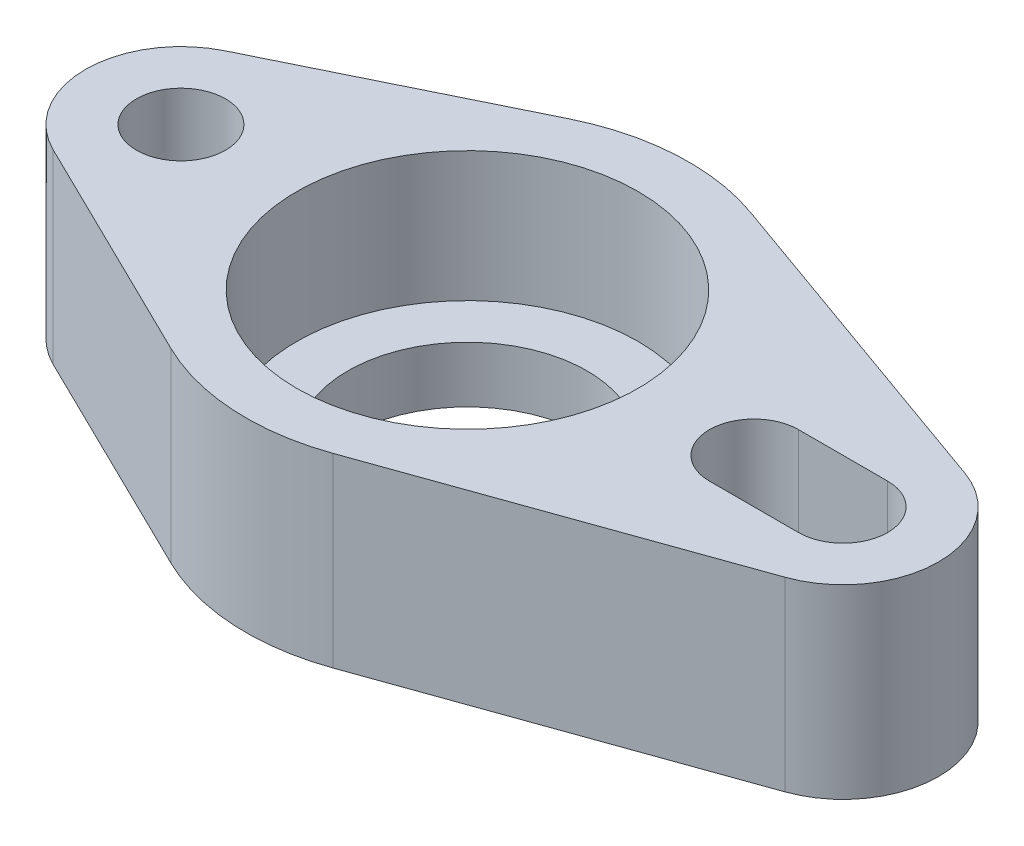
ISO-10303-21;
HEADER;
FILE_DESCRIPTION(('STEP AP214'),'2;1');
FILE_NAME('part.step','',(''),(''),'','','');
FILE_SCHEMA(('AUTOMOTIVE_DESIGN { 1 0 10303 214 1 1 1 1 }'));
ENDSEC;
DATA;
#1=APPLICATION_CONTEXT('core data for automotive mechanical design processes');
#2=APPLICATION_PROTOCOL_DEFINITION('international standard','automotive_design',2000,#1);
#3=PRODUCT_CONTEXT('',#1,'mechanical');
#4=PRODUCT('Part','Part','',(#3));
#5=PRODUCT_RELATED_PRODUCT_CATEGORY('part','',(#4));
#6=PRODUCT_DEFINITION_FORMATION('','',#4);
#7=PRODUCT_DEFINITION_CONTEXT('part definition',#1,'design');
#8=PRODUCT_DEFINITION('design','',#6,#7);
#9=PRODUCT_DEFINITION_SHAPE('','',#8);
#10=(LENGTH_UNIT() NAMED_UNIT(*) SI_UNIT(.MILLI.,.METRE.));
#11=(NAMED_UNIT(*) PLANE_ANGLE_UNIT() SI_UNIT($,.RADIAN.));
#12=(NAMED_UNIT(*) SI_UNIT($,.STERADIAN.) SOLID_ANGLE_UNIT());
#13=UNCERTAINTY_MEASURE_WITH_UNIT(LENGTH_MEASURE(1.E-05),#10,'distance_accuracy_value','');
#14=(GEOMETRIC_REPRESENTATION_CONTEXT(3) GLOBAL_UNCERTAINTY_ASSIGNED_CONTEXT((#13)) GLOBAL_UNIT_ASSIGNED_CONTEXT((#10,
#11,#12)) REPRESENTATION_CONTEXT('',''));
#15=CARTESIAN_POINT('',(0.,0.,0.));
#16=DIRECTION('',(0.,0.,1.));
#17=DIRECTION('',(1.,0.,0.));
#18=AXIS2_PLACEMENT_3D('',#15,#16,#17);
#19=CARTESIAN_POINT('',(2.91966101694915,7.3,8.19546091114511));
#20=DIRECTION('',(0.335593220338983,0.,0.942007001281047));
#21=DIRECTION('',(0.942007001281047,0.,-0.335593220338983));
#22=AXIS2_PLACEMENT_3D('',#19,#20,#21);
#23=PLANE('',#22);
#24=DIRECTION('',(-0.942007001281047,0.,0.335593220338983));
#25=VECTOR('',#24,1.);
#26=CARTESIAN_POINT('',(2.91966101694915,0.,8.19546091114511));
#27=LINE('',#26,#25);
#28=CARTESIAN_POINT('',(16.0084745762712,0.,3.53252625480393));
#29=VERTEX_POINT('',#28);
#30=CARTESIAN_POINT('',(2.91966101694915,0.,8.19546091114511));
#31=VERTEX_POINT('',#30);
#32=EDGE_CURVE('E236',#29,#31,#27,.T.);
#33=ORIENTED_EDGE('',*,*,#32,.F.);
#34=DIRECTION('',(0.,-1.,0.));
#35=VECTOR('',#34,1.);
#36=CARTESIAN_POINT('',(16.0084745762712,7.3,3.53252625480393));
#37=LINE('',#36,#35);
#38=CARTESIAN_POINT('',(16.0084745762712,7.3,3.53252625480393));
#39=VERTEX_POINT('',#38);
#40=EDGE_CURVE('E57',#39,#29,#37,.T.);
#41=ORIENTED_EDGE('',*,*,#40,.F.);
#42=DIRECTION('',(-0.942007001281047,0.,0.335593220338983));
#43=VECTOR('',#42,1.);
#44=CARTESIAN_POINT('',(2.91966101694915,7.3,8.19546091114511));
#45=LINE('',#44,#43);
#46=CARTESIAN_POINT('',(2.91966101694915,7.3,8.19546091114511));
#47=VERTEX_POINT('',#46);
#48=EDGE_CURVE('E277',#39,#47,#45,.T.);
#49=ORIENTED_EDGE('',*,*,#48,.T.);
#50=DIRECTION('',(0.,-1.,0.));
#51=VECTOR('',#50,1.);
#52=CARTESIAN_POINT('',(2.91966101694915,7.3,8.19546091114511));
#53=LINE('',#52,#51);
#54=EDGE_CURVE('E112',#47,#31,#53,.T.);
#55=ORIENTED_EDGE('',*,*,#54,.T.);
#56=EDGE_LOOP('',(#33,#41,#49,#55));
#57=FACE_BOUND('',#56,.T.);
#58=ADVANCED_FACE('F47',(#57),#23,.T.);
#59=CARTESIAN_POINT('',(14.75,7.3,0.));
#60=DIRECTION('',(0.,-1.,0.));
#61=DIRECTION('',(0.,0.,-1.));
#62=AXIS2_PLACEMENT_3D('',#59,#60,#61);
#63=CYLINDRICAL_SURFACE('',#62,3.75);
#64=CARTESIAN_POINT('',(14.75,0.,0.));
#65=DIRECTION('',(0.,1.,0.));
#66=DIRECTION('',(0.,0.,1.));
#67=AXIS2_PLACEMENT_3D('',#64,#65,#66);
#68=CIRCLE('',#67,3.75);
#69=CARTESIAN_POINT('',(16.0084745762712,0.,-3.53252625480393));
#70=VERTEX_POINT('',#69);
#71=EDGE_CURVE('E232',#29,#70,#68,.T.);
#72=ORIENTED_EDGE('',*,*,#71,.T.);
#73=DIRECTION('',(0.,-1.,0.));
#74=VECTOR('',#73,1.);
#75=CARTESIAN_POINT('',(16.0084745762712,7.3,-3.53252625480393));
#76=LINE('',#75,#74);
#77=CARTESIAN_POINT('',(16.0084745762712,7.3,-3.53252625480393));
#78=VERTEX_POINT('',#77);
#79=EDGE_CURVE('E187',#78,#70,#76,.T.);
#80=ORIENTED_EDGE('',*,*,#79,.F.);
#81=CARTESIAN_POINT('',(14.75,7.3,0.));
#82=DIRECTION('',(0.,1.,0.));
#83=DIRECTION('',(0.,0.,1.));
#84=AXIS2_PLACEMENT_3D('',#81,#82,#83);
#85=CIRCLE('',#84,3.75);
#86=EDGE_CURVE('E273',#39,#78,#85,.T.);
#87=ORIENTED_EDGE('',*,*,#86,.F.);
#88=ORIENTED_EDGE('',*,*,#40,.T.);
#89=EDGE_LOOP('',(#72,#80,#87,#88));
#90=FACE_BOUND('',#89,.T.);
#91=ADVANCED_FACE('F341',(#90),#63,.T.);
#92=CARTESIAN_POINT('',(2.91966101694915,7.3,-8.19546091114511));
#93=DIRECTION('',(-0.335593220338983,0.,0.942007001281047));
#94=DIRECTION('',(0.942007001281047,0.,0.335593220338983));
#95=AXIS2_PLACEMENT_3D('',#92,#93,#94);
#96=PLANE('',#95);
#97=DIRECTION('',(-0.942007001281047,0.,-0.335593220338983));
#98=VECTOR('',#97,1.);
#99=CARTESIAN_POINT('',(2.91966101694915,0.,-8.19546091114511));
#100=LINE('',#99,#98);
#101=CARTESIAN_POINT('',(2.91966101694916,0.,-8.19546091114511));
#102=VERTEX_POINT('',#101);
#103=EDGE_CURVE('E228',#70,#102,#100,.T.);
#104=ORIENTED_EDGE('',*,*,#103,.T.);
#105=DIRECTION('',(0.,-1.,0.));
#106=VECTOR('',#105,1.);
#107=CARTESIAN_POINT('',(2.91966101694916,7.3,-8.19546091114511));
#108=LINE('',#107,#106);
#109=CARTESIAN_POINT('',(2.91966101694916,7.3,-8.19546091114511));
#110=VERTEX_POINT('',#109);
#111=EDGE_CURVE('E183',#110,#102,#108,.T.);
#112=ORIENTED_EDGE('',*,*,#111,.F.);
#113=DIRECTION('',(-0.942007001281047,0.,-0.335593220338983));
#114=VECTOR('',#113,1.);
#115=CARTESIAN_POINT('',(2.91966101694915,7.3,-8.19546091114511));
#116=LINE('',#115,#114);
#117=EDGE_CURVE('E269',#78,#110,#116,.T.);
#118=ORIENTED_EDGE('',*,*,#117,.F.);
#119=ORIENTED_EDGE('',*,*,#79,.T.);
#120=EDGE_LOOP('',(#104,#112,#118,#119));
#121=FACE_BOUND('',#120,.T.);
#122=ADVANCED_FACE('F346',(#121),#96,.F.);
#123=CARTESIAN_POINT('',(0.,7.3,0.));
#124=DIRECTION('',(0.,-1.,0.));
#125=DIRECTION('',(0.,0.,-1.));
#126=AXIS2_PLACEMENT_3D('',#123,#124,#125);
#127=CYLINDRICAL_SURFACE('',#126,8.7);
#128=CARTESIAN_POINT('',(0.,0.,0.));
#129=DIRECTION('',(0.,1.,0.));
#130=DIRECTION('',(0.,0.,1.));
#131=AXIS2_PLACEMENT_3D('',#128,#129,#130);
#132=CIRCLE('',#131,8.7);
#133=CARTESIAN_POINT('',(-3.828,0.,-7.81258062358399));
#134=VERTEX_POINT('',#133);
#135=EDGE_CURVE('E224',#102,#134,#132,.T.);
#136=ORIENTED_EDGE('',*,*,#135,.T.);
#137=DIRECTION('',(0.,-1.,0.));
#138=VECTOR('',#137,1.);
#139=CARTESIAN_POINT('',(-3.828,7.3,-7.81258062358399));
#140=LINE('',#139,#138);
#141=CARTESIAN_POINT('',(-3.828,7.3,-7.81258062358399));
#142=VERTEX_POINT('',#141);
#143=EDGE_CURVE('E176',#142,#134,#140,.T.);
#144=ORIENTED_EDGE('',*,*,#143,.F.);
#145=CARTESIAN_POINT('',(0.,7.3,0.));
#146=DIRECTION('',(0.,1.,0.));
#147=DIRECTION('',(0.,0.,1.));
#148=AXIS2_PLACEMENT_3D('',#145,#146,#147);
#149=CIRCLE('',#148,8.7);
#150=EDGE_CURVE('E266',#110,#142,#149,.T.);
#151=ORIENTED_EDGE('',*,*,#150,.F.);
#152=ORIENTED_EDGE('',*,*,#111,.T.);
#153=EDGE_LOOP('',(#136,#144,#151,#152));
#154=FACE_BOUND('',#153,.T.);
#155=ADVANCED_FACE('F374',(#154),#127,.T.);
#156=CARTESIAN_POINT('',(-3.828,7.3,-7.81258062358399));
#157=DIRECTION('',(-0.44,0.,-0.897997772825746));
#158=DIRECTION('',(-0.897997772825746,0.,0.44));
#159=AXIS2_PLACEMENT_3D('',#156,#157,#158);
#160=PLANE('',#159);
#161=DIRECTION('',(0.897997772825746,0.,-0.44));
#162=VECTOR('',#161,1.);
#163=CARTESIAN_POINT('',(-3.828,0.,-7.81258062358399));
#164=LINE('',#163,#162);
#165=CARTESIAN_POINT('',(-12.9,0.,-3.36749164809655));
#166=VERTEX_POINT('',#165);
#167=EDGE_CURVE('E220',#166,#134,#164,.T.);
#168=ORIENTED_EDGE('',*,*,#167,.F.);
#169=DIRECTION('',(0.,-1.,0.));
#170=VECTOR('',#169,1.);
#171=CARTESIAN_POINT('',(-12.9,7.3,-3.36749164809655));
#172=LINE('',#171,#170);
#173=CARTESIAN_POINT('',(-12.9,7.3,-3.36749164809655));
#174=VERTEX_POINT('',#173);
#175=EDGE_CURVE('E172',#174,#166,#172,.T.);
#176=ORIENTED_EDGE('',*,*,#175,.F.);
#177=DIRECTION('',(0.897997772825746,0.,-0.44));
#178=VECTOR('',#177,1.);
#179=CARTESIAN_POINT('',(-3.828,7.3,-7.81258062358399));
#180=LINE('',#179,#178);
#181=EDGE_CURVE('E164',#174,#142,#180,.T.);
#182=ORIENTED_EDGE('',*,*,#181,.T.);
#183=ORIENTED_EDGE('',*,*,#143,.T.);
#184=EDGE_LOOP('',(#168,#176,#182,#183));
#185=FACE_BOUND('',#184,.T.);
#186=ADVANCED_FACE('F377',(#185),#160,.T.);
#187=CARTESIAN_POINT('',(-11.25,7.3,0.));
#188=DIRECTION('',(0.,-1.,0.));
#189=DIRECTION('',(0.,0.,-1.));
#190=AXIS2_PLACEMENT_3D('',#187,#188,#189);
#191=CYLINDRICAL_SURFACE('',#190,3.75);
#192=CARTESIAN_POINT('',(-11.25,0.,0.));
#193=DIRECTION('',(0.,1.,0.));
#194=DIRECTION('',(0.,0.,1.));
#195=AXIS2_PLACEMENT_3D('',#192,#193,#194);
#196=CIRCLE('',#195,3.75);
#197=CARTESIAN_POINT('',(-12.9,0.,3.36749164809655));
#198=VERTEX_POINT('',#197);
#199=EDGE_CURVE('E170',#166,#198,#196,.T.);
#200=ORIENTED_EDGE('',*,*,#199,.T.);
#201=DIRECTION('',(0.,-1.,0.));
#202=VECTOR('',#201,1.);
#203=CARTESIAN_POINT('',(-12.9,7.3,3.36749164809655));
#204=LINE('',#203,#202);
#205=CARTESIAN_POINT('',(-12.9,7.3,3.36749164809655));
#206=VERTEX_POINT('',#205);
#207=EDGE_CURVE('E153',#206,#198,#204,.T.);
#208=ORIENTED_EDGE('',*,*,#207,.F.);
#209=CARTESIAN_POINT('',(-11.25,7.3,0.));
#210=DIRECTION('',(0.,1.,0.));
#211=DIRECTION('',(0.,0.,1.));
#212=AXIS2_PLACEMENT_3D('',#209,#210,#211);
#213=CIRCLE('',#212,3.75);
#214=EDGE_CURVE('E157',#174,#206,#213,.T.);
#215=ORIENTED_EDGE('',*,*,#214,.F.);
#216=ORIENTED_EDGE('',*,*,#175,.T.);
#217=EDGE_LOOP('',(#200,#208,#215,#216));
#218=FACE_BOUND('',#217,.T.);
#219=ADVANCED_FACE('F168',(#218),#191,.T.);
#220=CARTESIAN_POINT('',(-3.828,7.3,7.81258062358399));
#221=DIRECTION('',(0.44,0.,-0.897997772825746));
#222=DIRECTION('',(-0.897997772825746,0.,-0.44));
#223=AXIS2_PLACEMENT_3D('',#220,#221,#222);
#224=PLANE('',#223);
#225=DIRECTION('',(0.897997772825746,0.,0.44));
#226=VECTOR('',#225,1.);
#227=CARTESIAN_POINT('',(-3.828,0.,7.81258062358399));
#228=LINE('',#227,#226);
#229=CARTESIAN_POINT('',(-3.828,0.,7.81258062358399));
#230=VERTEX_POINT('',#229);
#231=EDGE_CURVE('E215',#198,#230,#228,.T.);
#232=ORIENTED_EDGE('',*,*,#231,.T.);
#233=DIRECTION('',(0.,-1.,0.));
#234=VECTOR('',#233,1.);
#235=CARTESIAN_POINT('',(-3.828,7.3,7.81258062358399));
#236=LINE('',#235,#234);
#237=CARTESIAN_POINT('',(-3.828,7.3,7.81258062358399));
#238=VERTEX_POINT('',#237);
#239=EDGE_CURVE('E155',#238,#230,#236,.T.);
#240=ORIENTED_EDGE('',*,*,#239,.F.);
#241=DIRECTION('',(0.897997772825746,0.,0.44));
#242=VECTOR('',#241,1.);
#243=CARTESIAN_POINT('',(-3.828,7.3,7.81258062358399));
#244=LINE('',#243,#242);
#245=EDGE_CURVE('E148',#206,#238,#244,.T.);
#246=ORIENTED_EDGE('',*,*,#245,.F.);
#247=ORIENTED_EDGE('',*,*,#207,.T.);
#248=EDGE_LOOP('',(#232,#240,#246,#247));
#249=FACE_BOUND('',#248,.T.);
#250=ADVANCED_FACE('F151',(#249),#224,.F.);
#251=CARTESIAN_POINT('',(11.25,7.3,0.));
#252=DIRECTION('',(0.,-1.,0.));
#253=DIRECTION('',(0.,0.,-1.));
#254=AXIS2_PLACEMENT_3D('',#251,#252,#253);
#255=CYLINDRICAL_SURFACE('',#254,1.75);
#256=CARTESIAN_POINT('',(11.25,0.,0.));
#257=DIRECTION('',(0.,1.,0.));
#258=DIRECTION('',(0.,0.,1.));
#259=AXIS2_PLACEMENT_3D('',#256,#257,#258);
#260=CIRCLE('',#259,1.75);
#261=CARTESIAN_POINT('',(11.25,0.,-1.75));
#262=VERTEX_POINT('',#261);
#263=CARTESIAN_POINT('',(11.25,0.,1.75));
#264=VERTEX_POINT('',#263);
#265=EDGE_CURVE('E250',#262,#264,#260,.T.);
#266=ORIENTED_EDGE('',*,*,#265,.F.);
#267=DIRECTION('',(0.,-1.,0.));
#268=VECTOR('',#267,1.);
#269=CARTESIAN_POINT('',(11.25,7.3,-1.75));
#270=LINE('',#269,#268);
#271=CARTESIAN_POINT('',(11.25,7.3,-1.75));
#272=VERTEX_POINT('',#271);
#273=EDGE_CURVE('E119',#272,#262,#270,.T.);
#274=ORIENTED_EDGE('',*,*,#273,.F.);
#275=CARTESIAN_POINT('',(11.25,7.3,0.));
#276=DIRECTION('',(0.,1.,0.));
#277=DIRECTION('',(0.,0.,1.));
#278=AXIS2_PLACEMENT_3D('',#275,#276,#277);
#279=CIRCLE('',#278,1.75);
#280=CARTESIAN_POINT('',(11.25,7.3,1.75));
#281=VERTEX_POINT('',#280);
#282=EDGE_CURVE('E212',#272,#281,#279,.T.);
#283=ORIENTED_EDGE('',*,*,#282,.T.);
#284=DIRECTION('',(0.,-1.,0.));
#285=VECTOR('',#284,1.);
#286=CARTESIAN_POINT('',(11.25,7.3,1.75));
#287=LINE('',#286,#285);
#288=EDGE_CURVE('E193',#281,#264,#287,.T.);
#289=ORIENTED_EDGE('',*,*,#288,.T.);
#290=EDGE_LOOP('',(#266,#274,#283,#289));
#291=FACE_BOUND('',#290,.T.);
#292=ADVANCED_FACE('F49',(#291),#255,.F.);
#293=CARTESIAN_POINT('',(0.,7.3,-1.75));
#294=DIRECTION('',(0.,0.,-1.));
#295=DIRECTION('',(-1.,0.,0.));
#296=AXIS2_PLACEMENT_3D('',#293,#294,#295);
#297=PLANE('',#296);
#298=DIRECTION('',(1.,0.,0.));
#299=VECTOR('',#298,1.);
#300=CARTESIAN_POINT('',(0.,0.,-1.75));
#301=LINE('',#300,#299);
#302=CARTESIAN_POINT('',(14.75,0.,-1.75));
#303=VERTEX_POINT('',#302);
#304=EDGE_CURVE('E247',#262,#303,#301,.T.);
#305=ORIENTED_EDGE('',*,*,#304,.T.);
#306=DIRECTION('',(0.,-1.,0.));
#307=VECTOR('',#306,1.);
#308=CARTESIAN_POINT('',(14.75,7.3,-1.75));
#309=LINE('',#308,#307);
#310=CARTESIAN_POINT('',(14.75,7.3,-1.75));
#311=VERTEX_POINT('',#310);
#312=EDGE_CURVE('E200',#311,#303,#309,.T.);
#313=ORIENTED_EDGE('',*,*,#312,.F.);
#314=DIRECTION('',(1.,0.,0.));
#315=VECTOR('',#314,1.);
#316=CARTESIAN_POINT('',(0.,7.3,-1.75));
#317=LINE('',#316,#315);
#318=EDGE_CURVE('E288',#272,#311,#317,.T.);
#319=ORIENTED_EDGE('',*,*,#318,.F.);
#320=ORIENTED_EDGE('',*,*,#273,.T.);
#321=EDGE_LOOP('',(#305,#313,#319,#320));
#322=FACE_BOUND('',#321,.T.);
#323=ADVANCED_FACE('F355',(#322),#297,.F.);
#324=CARTESIAN_POINT('',(14.75,7.3,0.));
#325=DIRECTION('',(0.,-1.,0.));
#326=DIRECTION('',(0.,0.,-1.));
#327=AXIS2_PLACEMENT_3D('',#324,#325,#326);
#328=CYLINDRICAL_SURFACE('',#327,1.75);
#329=CARTESIAN_POINT('',(14.75,0.,0.));
#330=DIRECTION('',(0.,1.,0.));
#331=DIRECTION('',(0.,0.,1.));
#332=AXIS2_PLACEMENT_3D('',#329,#330,#331);
#333=CIRCLE('',#332,1.75);
#334=CARTESIAN_POINT('',(14.75,0.,1.75));
#335=VERTEX_POINT('',#334);
#336=EDGE_CURVE('E243',#335,#303,#333,.T.);
#337=ORIENTED_EDGE('',*,*,#336,.F.);
#338=DIRECTION('',(0.,-1.,0.));
#339=VECTOR('',#338,1.);
#340=CARTESIAN_POINT('',(14.75,7.3,1.75));
#341=LINE('',#340,#339);
#342=CARTESIAN_POINT('',(14.75,7.3,1.75));
#343=VERTEX_POINT('',#342);
#344=EDGE_CURVE('E196',#343,#335,#341,.T.);
#345=ORIENTED_EDGE('',*,*,#344,.F.);
#346=CARTESIAN_POINT('',(14.75,7.3,0.));
#347=DIRECTION('',(0.,1.,0.));
#348=DIRECTION('',(0.,0.,1.));
#349=AXIS2_PLACEMENT_3D('',#346,#347,#348);
#350=CIRCLE('',#349,1.75);
#351=EDGE_CURVE('E284',#343,#311,#350,.T.);
#352=ORIENTED_EDGE('',*,*,#351,.T.);
#353=ORIENTED_EDGE('',*,*,#312,.T.);
#354=EDGE_LOOP('',(#337,#345,#352,#353));
#355=FACE_BOUND('',#354,.T.);
#356=ADVANCED_FACE('F314',(#355),#328,.F.);
#357=CARTESIAN_POINT('',(0.,7.3,0.));
#358=DIRECTION('',(0.,-1.,0.));
#359=DIRECTION('',(0.,0.,-1.));
#360=AXIS2_PLACEMENT_3D('',#357,#358,#359);
#361=CYLINDRICAL_SURFACE('',#360,6.7);
#362=CARTESIAN_POINT('',(0.,2.2,0.));
#363=DIRECTION('',(0.,1.,0.));
#364=DIRECTION('',(0.,0.,1.));
#365=AXIS2_PLACEMENT_3D('',#362,#363,#364);
#366=CIRCLE('',#365,6.7);
#367=CARTESIAN_POINT('',(0.,2.2,6.7));
#368=VERTEX_POINT('',#367);
#369=EDGE_CURVE('E11',#368,#368,#366,.T.);
#370=ORIENTED_EDGE('',*,*,#369,.F.);
#371=EDGE_LOOP('',(#370));
#372=FACE_BOUND('',#371,.T.);
#373=CARTESIAN_POINT('',(0.,7.3,0.));
#374=DIRECTION('',(0.,1.,0.));
#375=DIRECTION('',(0.,0.,1.));
#376=AXIS2_PLACEMENT_3D('',#373,#374,#375);
#377=CIRCLE('',#376,6.7);
#378=CARTESIAN_POINT('',(0.,7.3,6.7));
#379=VERTEX_POINT('',#378);
#380=EDGE_CURVE('E258',#379,#379,#377,.T.);
#381=ORIENTED_EDGE('',*,*,#380,.T.);
#382=EDGE_LOOP('',(#381));
#383=FACE_BOUND('',#382,.T.);
#384=ADVANCED_FACE('F310',(#372,#383),#361,.F.);
#385=CARTESIAN_POINT('',(0.,7.3,0.));
#386=DIRECTION('',(0.,-1.,0.));
#387=DIRECTION('',(0.,0.,-1.));
#388=AXIS2_PLACEMENT_3D('',#385,#386,#387);
#389=CYLINDRICAL_SURFACE('',#388,8.7);
#390=CARTESIAN_POINT('',(0.,0.,0.));
#391=DIRECTION('',(0.,1.,0.));
#392=DIRECTION('',(0.,0.,1.));
#393=AXIS2_PLACEMENT_3D('',#390,#391,#392);
#394=CIRCLE('',#393,8.7);
#395=EDGE_CURVE('E105',#230,#31,#394,.T.);
#396=ORIENTED_EDGE('',*,*,#395,.T.);
#397=ORIENTED_EDGE('',*,*,#54,.F.);
#398=CARTESIAN_POINT('',(0.,7.3,0.));
#399=DIRECTION('',(0.,1.,0.));
#400=DIRECTION('',(0.,0.,1.));
#401=AXIS2_PLACEMENT_3D('',#398,#399,#400);
#402=CIRCLE('',#401,8.7);
#403=EDGE_CURVE('E65',#238,#47,#402,.T.);
#404=ORIENTED_EDGE('',*,*,#403,.F.);
#405=ORIENTED_EDGE('',*,*,#239,.T.);
#406=EDGE_LOOP('',(#396,#397,#404,#405));
#407=FACE_BOUND('',#406,.T.);
#408=ADVANCED_FACE('F313',(#407),#389,.T.);
#409=CARTESIAN_POINT('',(0.,7.3,1.75));
#410=DIRECTION('',(0.,0.,-1.));
#411=DIRECTION('',(-1.,0.,0.));
#412=AXIS2_PLACEMENT_3D('',#409,#410,#411);
#413=PLANE('',#412);
#414=DIRECTION('',(1.,0.,0.));
#415=VECTOR('',#414,1.);
#416=CARTESIAN_POINT('',(0.,0.,1.75));
#417=LINE('',#416,#415);
#418=EDGE_CURVE('E239',#264,#335,#417,.T.);
#419=ORIENTED_EDGE('',*,*,#418,.F.);
#420=ORIENTED_EDGE('',*,*,#288,.F.);
#421=DIRECTION('',(1.,0.,0.));
#422=VECTOR('',#421,1.);
#423=CARTESIAN_POINT('',(0.,7.3,1.75));
#424=LINE('',#423,#422);
#425=EDGE_CURVE('E280',#281,#343,#424,.T.);
#426=ORIENTED_EDGE('',*,*,#425,.T.);
#427=ORIENTED_EDGE('',*,*,#344,.T.);
#428=EDGE_LOOP('',(#419,#420,#426,#427));
#429=FACE_BOUND('',#428,.T.);
#430=ADVANCED_FACE('F327',(#429),#413,.T.);
#431=CARTESIAN_POINT('',(-11.25,7.3,0.));
#432=DIRECTION('',(0.,-1.,0.));
#433=DIRECTION('',(0.,0.,-1.));
#434=AXIS2_PLACEMENT_3D('',#431,#432,#433);
#435=CYLINDRICAL_SURFACE('',#434,1.75);
#436=CARTESIAN_POINT('',(-11.25,7.3,0.));
#437=DIRECTION('',(0.,1.,0.));
#438=DIRECTION('',(0.,0.,1.));
#439=AXIS2_PLACEMENT_3D('',#436,#437,#438);
#440=CIRCLE('',#439,1.75);
#441=CARTESIAN_POINT('',(-11.25,7.3,1.75));
#442=VERTEX_POINT('',#441);
#443=EDGE_CURVE('E197',#442,#442,#440,.T.);
#444=ORIENTED_EDGE('',*,*,#443,.T.);
#445=EDGE_LOOP('',(#444));
#446=FACE_BOUND('',#445,.T.);
#447=CARTESIAN_POINT('',(-11.25,0.,0.));
#448=DIRECTION('',(0.,1.,0.));
#449=DIRECTION('',(0.,0.,1.));
#450=AXIS2_PLACEMENT_3D('',#447,#448,#449);
#451=CIRCLE('',#450,1.75);
#452=CARTESIAN_POINT('',(-11.25,0.,1.75));
#453=VERTEX_POINT('',#452);
#454=EDGE_CURVE('E208',#453,#453,#451,.T.);
#455=ORIENTED_EDGE('',*,*,#454,.F.);
#456=EDGE_LOOP('',(#455));
#457=FACE_BOUND('',#456,.T.);
#458=ADVANCED_FACE('F320',(#446,#457),#435,.F.);
#459=CARTESIAN_POINT('',(0.,7.3,0.));
#460=DIRECTION('',(0.,1.,0.));
#461=DIRECTION('',(0.,0.,1.));
#462=AXIS2_PLACEMENT_3D('',#459,#460,#461);
#463=PLANE('',#462);
#464=ORIENTED_EDGE('',*,*,#282,.F.);
#465=ORIENTED_EDGE('',*,*,#318,.T.);
#466=ORIENTED_EDGE('',*,*,#351,.F.);
#467=ORIENTED_EDGE('',*,*,#425,.F.);
#468=EDGE_LOOP('',(#464,#465,#466,#467));
#469=FACE_BOUND('',#468,.T.);
#470=ORIENTED_EDGE('',*,*,#48,.F.);
#471=ORIENTED_EDGE('',*,*,#86,.T.);
#472=ORIENTED_EDGE('',*,*,#117,.T.);
#473=ORIENTED_EDGE('',*,*,#150,.T.);
#474=ORIENTED_EDGE('',*,*,#181,.F.);
#475=ORIENTED_EDGE('',*,*,#214,.T.);
#476=ORIENTED_EDGE('',*,*,#245,.T.);
#477=ORIENTED_EDGE('',*,*,#403,.T.);
#478=EDGE_LOOP('',(#470,#471,#472,#473,#474,#475,#476,#477));
#479=FACE_BOUND('',#478,.T.);
#480=ORIENTED_EDGE('',*,*,#380,.F.);
#481=EDGE_LOOP('',(#480));
#482=FACE_BOUND('',#481,.T.);
#483=ORIENTED_EDGE('',*,*,#443,.F.);
#484=EDGE_LOOP('',(#483));
#485=FACE_BOUND('',#484,.T.);
#486=ADVANCED_FACE('F161',(#469,#479,#482,#485),#463,.T.);
#487=CARTESIAN_POINT('',(0.,0.,0.));
#488=DIRECTION('',(0.,1.,0.));
#489=DIRECTION('',(0.,0.,1.));
#490=AXIS2_PLACEMENT_3D('',#487,#488,#489);
#491=PLANE('',#490);
#492=ORIENTED_EDGE('',*,*,#265,.T.);
#493=ORIENTED_EDGE('',*,*,#418,.T.);
#494=ORIENTED_EDGE('',*,*,#336,.T.);
#495=ORIENTED_EDGE('',*,*,#304,.F.);
#496=EDGE_LOOP('',(#492,#493,#494,#495));
#497=FACE_BOUND('',#496,.T.);
#498=ORIENTED_EDGE('',*,*,#32,.T.);
#499=ORIENTED_EDGE('',*,*,#395,.F.);
#500=ORIENTED_EDGE('',*,*,#231,.F.);
#501=ORIENTED_EDGE('',*,*,#199,.F.);
#502=ORIENTED_EDGE('',*,*,#167,.T.);
#503=ORIENTED_EDGE('',*,*,#135,.F.);
#504=ORIENTED_EDGE('',*,*,#103,.F.);
#505=ORIENTED_EDGE('',*,*,#71,.F.);
#506=EDGE_LOOP('',(#498,#499,#500,#501,#502,#503,#504,#505));
#507=FACE_BOUND('',#506,.T.);
#508=ORIENTED_EDGE('',*,*,#454,.T.);
#509=EDGE_LOOP('',(#508));
#510=FACE_BOUND('',#509,.T.);
#511=CARTESIAN_POINT('',(0.,0.,0.));
#512=DIRECTION('',(0.,1.,0.));
#513=DIRECTION('',(0.,0.,1.));
#514=AXIS2_PLACEMENT_3D('',#511,#512,#513);
#515=CIRCLE('',#514,4.7);
#516=CARTESIAN_POINT('',(0.,0.,4.7));
#517=VERTEX_POINT('',#516);
#518=EDGE_CURVE('E293',#517,#517,#515,.T.);
#519=ORIENTED_EDGE('',*,*,#518,.T.);
#520=EDGE_LOOP('',(#519));
#521=FACE_BOUND('',#520,.T.);
#522=ADVANCED_FACE('F319',(#497,#507,#510,#521),#491,.F.);
#523=CARTESIAN_POINT('',(0.,2.2,0.));
#524=DIRECTION('',(0.,-1.,0.));
#525=DIRECTION('',(0.,0.,-1.));
#526=AXIS2_PLACEMENT_3D('',#523,#524,#525);
#527=CYLINDRICAL_SURFACE('',#526,4.7);
#528=CARTESIAN_POINT('',(0.,2.2,0.));
#529=DIRECTION('',(0.,1.,0.));
#530=DIRECTION('',(0.,0.,1.));
#531=AXIS2_PLACEMENT_3D('',#528,#529,#530);
#532=CIRCLE('',#531,4.7);
#533=CARTESIAN_POINT('',(0.,2.2,4.7));
#534=VERTEX_POINT('',#533);
#535=EDGE_CURVE('E254',#534,#534,#532,.T.);
#536=ORIENTED_EDGE('',*,*,#535,.T.);
#537=EDGE_LOOP('',(#536));
#538=FACE_BOUND('',#537,.T.);
#539=ORIENTED_EDGE('',*,*,#518,.F.);
#540=EDGE_LOOP('',(#539));
#541=FACE_BOUND('',#540,.T.);
#542=ADVANCED_FACE('F301',(#538,#541),#527,.F.);
#543=CARTESIAN_POINT('',(0.,2.2,0.));
#544=DIRECTION('',(0.,1.,0.));
#545=DIRECTION('',(0.,0.,1.));
#546=AXIS2_PLACEMENT_3D('',#543,#544,#545);
#547=PLANE('',#546);
#548=ORIENTED_EDGE('',*,*,#535,.F.);
#549=EDGE_LOOP('',(#548));
#550=FACE_BOUND('',#549,.T.);
#551=ORIENTED_EDGE('',*,*,#369,.T.);
#552=EDGE_LOOP('',(#551));
#553=FACE_BOUND('',#552,.T.);
#554=ADVANCED_FACE('F304',(#550,#553),#547,.T.);
#555=CLOSED_SHELL('',(#58,#91,#122,#155,#186,#219,#250,#292,#323,#356,#384,#408,#430,#458,#486,
#522,#542,#554));
#556=MANIFOLD_SOLID_BREP('B2',#555);
#557=ADVANCED_BREP_SHAPE_REPRESENTATION('',(#18,#556),#14);
#558=SHAPE_DEFINITION_REPRESENTATION(#9,#557);
ENDSEC;
END-ISO-10303-21;
